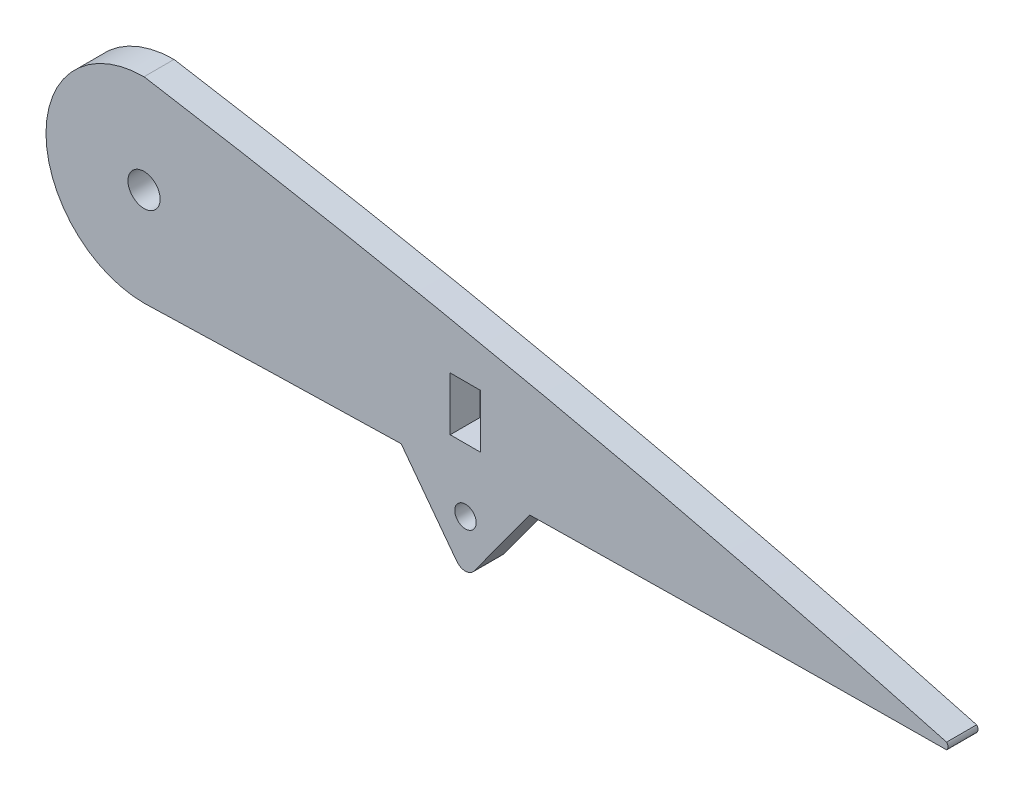
ISO-10303-21;
HEADER;
FILE_DESCRIPTION(('STEP AP214'),'2;1');
FILE_NAME('part.step','',(''),(''),'','','');
FILE_SCHEMA(('AUTOMOTIVE_DESIGN { 1 0 10303 214 1 1 1 1 }'));
ENDSEC;
DATA;
#1=APPLICATION_CONTEXT('core data for automotive mechanical design processes');
#2=APPLICATION_PROTOCOL_DEFINITION('international standard','automotive_design',2000,#1);
#3=PRODUCT_CONTEXT('',#1,'mechanical');
#4=PRODUCT('Part','Part','',(#3));
#5=PRODUCT_RELATED_PRODUCT_CATEGORY('part','',(#4));
#6=PRODUCT_DEFINITION_FORMATION('','',#4);
#7=PRODUCT_DEFINITION_CONTEXT('part definition',#1,'design');
#8=PRODUCT_DEFINITION('design','',#6,#7);
#9=PRODUCT_DEFINITION_SHAPE('','',#8);
#10=(LENGTH_UNIT() NAMED_UNIT(*) SI_UNIT(.MILLI.,.METRE.));
#11=(NAMED_UNIT(*) PLANE_ANGLE_UNIT() SI_UNIT($,.RADIAN.));
#12=(NAMED_UNIT(*) SI_UNIT($,.STERADIAN.) SOLID_ANGLE_UNIT());
#13=UNCERTAINTY_MEASURE_WITH_UNIT(LENGTH_MEASURE(1.E-05),#10,'distance_accuracy_value','');
#14=(GEOMETRIC_REPRESENTATION_CONTEXT(3) GLOBAL_UNCERTAINTY_ASSIGNED_CONTEXT((#13)) GLOBAL_UNIT_ASSIGNED_CONTEXT((#10,
#11,#12)) REPRESENTATION_CONTEXT('',''));
#15=CARTESIAN_POINT('',(0.,0.,0.));
#16=DIRECTION('',(0.,0.,1.));
#17=DIRECTION('',(1.,0.,0.));
#18=AXIS2_PLACEMENT_3D('',#15,#16,#17);
#19=CARTESIAN_POINT('',(138.143549961286,-100.777039100109,1.4));
#20=DIRECTION('',(-0.80787563884741,0.589352994526107,0.));
#21=DIRECTION('',(-0.589352994526107,-0.80787563884741,0.));
#22=AXIS2_PLACEMENT_3D('',#19,#20,#21);
#23=PLANE('',#22);
#24=DIRECTION('',(0.589352994526107,0.80787563884741,0.));
#25=VECTOR('',#24,1.);
#26=CARTESIAN_POINT('',(138.143549961286,-100.777039100109,-1.4));
#27=LINE('',#26,#25);
#28=CARTESIAN_POINT('',(205.887265796067,-7.91503921847926,-1.4));
#29=VERTEX_POINT('',#28);
#30=CARTESIAN_POINT('',(211.091334090503,-0.781385810383395,-1.4));
#31=VERTEX_POINT('',#30);
#32=EDGE_CURVE('E182',#29,#31,#27,.T.);
#33=ORIENTED_EDGE('',*,*,#32,.T.);
#34=DIRECTION('',(0.,0.,-1.));
#35=VECTOR('',#34,1.);
#36=CARTESIAN_POINT('',(211.091334090503,-0.781385810383395,1.4));
#37=LINE('',#36,#35);
#38=CARTESIAN_POINT('',(211.091334090503,-0.781385810383395,1.4));
#39=VERTEX_POINT('',#38);
#40=EDGE_CURVE('E11',#39,#31,#37,.T.);
#41=ORIENTED_EDGE('',*,*,#40,.F.);
#42=DIRECTION('',(0.589352994526107,0.80787563884741,0.));
#43=VECTOR('',#42,1.);
#44=CARTESIAN_POINT('',(138.143549961286,-100.777039100109,1.4));
#45=LINE('',#44,#43);
#46=CARTESIAN_POINT('',(205.887265796067,-7.91503921847926,1.4));
#47=VERTEX_POINT('',#46);
#48=EDGE_CURVE('E314',#47,#39,#45,.T.);
#49=ORIENTED_EDGE('',*,*,#48,.F.);
#50=DIRECTION('',(0.,0.,-1.));
#51=VECTOR('',#50,1.);
#52=CARTESIAN_POINT('',(205.887265796067,-7.91503921847926,1.4));
#53=LINE('',#52,#51);
#54=EDGE_CURVE('E216',#47,#29,#53,.T.);
#55=ORIENTED_EDGE('',*,*,#54,.T.);
#56=EDGE_LOOP('',(#33,#41,#49,#55));
#57=FACE_BOUND('',#56,.T.);
#58=ADVANCED_FACE('F37',(#57),#23,.F.);
#59=CARTESIAN_POINT('',(211.091334090503,-0.781385810385141,1.4));
#60=CARTESIAN_POINT('',(215.029550731743,-0.710611929763955,1.4));
#61=CARTESIAN_POINT('',(221.226120503685,-0.611852577215215,1.4));
#62=CARTESIAN_POINT('',(229.61763017219,-0.502926180051068,1.4));
#63=CARTESIAN_POINT('',(236.087353853958,-0.431514191746031,1.4));
#64=CARTESIAN_POINT('',(241.980776912645,-0.376520461471897,1.4));
#65=CARTESIAN_POINT('',(246.558970010783,-0.339535885925398,1.4));
#66=CARTESIAN_POINT('',(249.120490964528,-0.32127124245715,1.4));
#67=CARTESIAN_POINT('',(250.,-0.315,1.4));
#68=B_SPLINE_CURVE_WITH_KNOTS('',3,(#59,#60,#61,#62,#63,#64,#65,#66,#67),.UNSPECIFIED.,.F.,.F.,
(4,1,1,1,1,1,4),(0.846478182076588,0.893099151655267,0.919831064622048,0.945809917390178,
0.96968060086528,0.989589706283647,1.),.UNSPECIFIED.);
#69=DIRECTION('',(0.,0.,-1.));
#70=VECTOR('',#69,1.);
#71=SURFACE_OF_LINEAR_EXTRUSION('',#68,#70);
#72=CARTESIAN_POINT('',(211.091334090503,-0.781385810385141,-1.4));
#73=CARTESIAN_POINT('',(215.029550731743,-0.710611929763955,-1.4));
#74=CARTESIAN_POINT('',(221.226120503685,-0.611852577215215,-1.4));
#75=CARTESIAN_POINT('',(229.61763017219,-0.502926180051068,-1.4));
#76=CARTESIAN_POINT('',(236.087353853958,-0.431514191746031,-1.4));
#77=CARTESIAN_POINT('',(241.980776912645,-0.376520461471897,-1.4));
#78=CARTESIAN_POINT('',(246.558970010783,-0.339535885925398,-1.4));
#79=CARTESIAN_POINT('',(249.120490964528,-0.32127124245715,-1.4));
#80=CARTESIAN_POINT('',(250.,-0.315,-1.4));
#81=B_SPLINE_CURVE_WITH_KNOTS('',3,(#72,#73,#74,#75,#76,#77,#78,#79,#80),.UNSPECIFIED.,.F.,.F.,
(4,1,1,1,1,1,4),(0.846478182076588,0.893099151655267,0.919831064622048,0.945809917390178,
0.96968060086528,0.989589706283647,1.),.UNSPECIFIED.);
#82=CARTESIAN_POINT('',(250.,-0.315,-1.4));
#83=VERTEX_POINT('',#82);
#84=EDGE_CURVE('E185',#31,#83,#81,.T.);
#85=ORIENTED_EDGE('',*,*,#84,.T.);
#86=DIRECTION('',(0.,0.,-1.));
#87=VECTOR('',#86,1.);
#88=CARTESIAN_POINT('',(250.,-0.315,1.4));
#89=LINE('',#88,#87);
#90=CARTESIAN_POINT('',(250.,-0.315,1.4));
#91=VERTEX_POINT('',#90);
#92=EDGE_CURVE('E47',#91,#83,#89,.T.);
#93=ORIENTED_EDGE('',*,*,#92,.F.);
#94=EDGE_CURVE('E315',#39,#91,#68,.T.);
#95=ORIENTED_EDGE('',*,*,#94,.F.);
#96=ORIENTED_EDGE('',*,*,#40,.T.);
#97=EDGE_LOOP('',(#85,#93,#95,#96));
#98=FACE_BOUND('',#97,.T.);
#99=ADVANCED_FACE('F259',(#98),#71,.F.);
#100=CARTESIAN_POINT('',(249.685,0.,1.4));
#101=DIRECTION('',(0.,0.,-1.));
#102=DIRECTION('',(-1.,0.,0.));
#103=AXIS2_PLACEMENT_3D('',#100,#101,#102);
#104=CYLINDRICAL_SURFACE('',#103,0.445477272147512);
#105=CARTESIAN_POINT('',(249.685,0.,-1.4));
#106=DIRECTION('',(0.,0.,1.));
#107=DIRECTION('',(1.,0.,0.));
#108=AXIS2_PLACEMENT_3D('',#105,#106,#107);
#109=CIRCLE('',#108,0.445477272147512);
#110=CARTESIAN_POINT('',(250.,0.315,-1.4));
#111=VERTEX_POINT('',#110);
#112=EDGE_CURVE('E190',#111,#83,#109,.F.);
#113=ORIENTED_EDGE('',*,*,#112,.F.);
#114=DIRECTION('',(0.,0.,-1.));
#115=VECTOR('',#114,1.);
#116=CARTESIAN_POINT('',(250.,0.315,1.4));
#117=LINE('',#116,#115);
#118=CARTESIAN_POINT('',(250.,0.315,1.4));
#119=VERTEX_POINT('',#118);
#120=EDGE_CURVE('E222',#119,#111,#117,.T.);
#121=ORIENTED_EDGE('',*,*,#120,.F.);
#122=CARTESIAN_POINT('',(249.685,0.,1.4));
#123=DIRECTION('',(0.,0.,1.));
#124=DIRECTION('',(1.,0.,0.));
#125=AXIS2_PLACEMENT_3D('',#122,#123,#124);
#126=CIRCLE('',#125,0.445477272147512);
#127=EDGE_CURVE('E303',#119,#91,#126,.F.);
#128=ORIENTED_EDGE('',*,*,#127,.T.);
#129=ORIENTED_EDGE('',*,*,#92,.T.);
#130=EDGE_LOOP('',(#113,#121,#128,#129));
#131=FACE_BOUND('',#130,.T.);
#132=ADVANCED_FACE('F265',(#131),#104,.T.);
#133=CARTESIAN_POINT('',(250.,0.315,1.4));
#134=CARTESIAN_POINT('',(249.1556677398,0.545019817836279,1.4));
#135=CARTESIAN_POINT('',(246.72017569763,1.20851624251313,1.4));
#136=CARTESIAN_POINT('',(242.39133208333,2.35833905261626,1.4));
#137=CARTESIAN_POINT('',(236.8497612043,3.78762536446423,1.4));
#138=CARTESIAN_POINT('',(230.779918279366,5.29800883725429,1.4));
#139=CARTESIAN_POINT('',(224.455917947462,6.81286602762795,1.4));
#140=CARTESIAN_POINT('',(218.030543495663,8.2916106324586,1.4));
#141=CARTESIAN_POINT('',(211.562405044606,9.71973505661334,1.4));
#142=CARTESIAN_POINT('',(205.072411508973,11.0923749324442,1.4));
#143=CARTESIAN_POINT('',(198.567970912658,12.4078507263971,1.4));
#144=CARTESIAN_POINT('',(192.05236991352,13.6652979238497,1.4));
#145=CARTESIAN_POINT('',(185.527619972818,14.8640933031022,1.4));
#146=CARTESIAN_POINT('',(178.995338991115,16.0034047787228,1.4));
#147=CARTESIAN_POINT('',(172.457064741278,17.0823881152075,1.4));
#148=CARTESIAN_POINT('',(165.914317094847,18.0998278411168,1.4));
#149=CARTESIAN_POINT('',(159.368680729007,19.0545018148018,1.4));
#150=CARTESIAN_POINT('',(152.821805127969,19.9448856028229,1.4));
#151=CARTESIAN_POINT('',(146.275439401362,20.76928218283,1.4));
#152=CARTESIAN_POINT('',(139.731359791294,21.5256761133202,1.4));
#153=CARTESIAN_POINT('',(133.191836730309,22.2120042488889,1.4));
#154=CARTESIAN_POINT('',(126.658683026114,22.8257214286805,1.4));
#155=CARTESIAN_POINT('',(120.136770918309,23.363973266088,1.4));
#156=CARTESIAN_POINT('',(113.628567140501,23.8246773240715,1.4));
#157=CARTESIAN_POINT('',(107.152732037453,24.2002425936989,1.4));
#158=CARTESIAN_POINT('',(100.741095692949,24.4983995100481,1.4));
#159=CARTESIAN_POINT('',(94.4117527148801,24.6866497684384,1.4));
#160=CARTESIAN_POINT('',(88.1559179929208,24.7400956502598,1.4));
#161=CARTESIAN_POINT('',(81.9490430552625,24.658849143563,1.4));
#162=CARTESIAN_POINT('',(75.7805205915729,24.4410138083138,1.4));
#163=CARTESIAN_POINT('',(69.653692942001,24.0818848206021,1.4));
#164=CARTESIAN_POINT('',(63.5754105017725,23.5780063609574,1.4));
#165=CARTESIAN_POINT('',(57.5551895509689,22.9249466580897,1.4));
#166=CARTESIAN_POINT('',(51.6057626883655,22.1190655216041,1.4));
#167=CARTESIAN_POINT('',(45.7444003114454,21.1565644320825,1.4));
#168=CARTESIAN_POINT('',(39.9958575941734,20.035371389506,1.4));
#169=CARTESIAN_POINT('',(34.397919842374,18.756316234168,1.4));
#170=CARTESIAN_POINT('',(29.0103821035244,17.327615607561,1.4));
#171=CARTESIAN_POINT('',(23.9257984082512,15.7718649214876,1.4));
#172=CARTESIAN_POINT('',(19.2706788398757,14.1342694339559,1.4));
#173=CARTESIAN_POINT('',(15.1790983912921,12.4833354375465,1.4));
#174=CARTESIAN_POINT('',(11.7404757900967,10.8956109948061,1.4));
#175=CARTESIAN_POINT('',(8.95937186897629,9.42957736532332,1.4));
#176=CARTESIAN_POINT('',(6.76089118010329,8.10860319940964,1.4));
#177=CARTESIAN_POINT('',(5.03370974806799,6.92463805475642,1.4));
#178=CARTESIAN_POINT('',(3.67169493343308,5.85422966432144,1.4));
#179=CARTESIAN_POINT('',(2.59210112319415,4.87130536863603,1.4));
#180=CARTESIAN_POINT('',(1.73817566850273,3.95259574329487,1.4));
#181=CARTESIAN_POINT('',(1.06987082981603,3.08094637334676,1.4));
#182=CARTESIAN_POINT('',(0.571645410381898,2.24162210227498,1.4));
#183=CARTESIAN_POINT('',(0.215773898828885,1.43078539700941,1.4));
#184=CARTESIAN_POINT('',(0.102255581551055,0.88324169451159,1.4));
#185=CARTESIAN_POINT('',(0.047975,0.621425,1.4));
#186=B_SPLINE_CURVE_WITH_KNOTS('',3,(#133,#134,#135,#136,#137,#138,#139,#140,#141,#142,#143,
#144,#145,#146,#147,#148,#149,#150,#151,#152,#153,#154,#155,#156,#157,#158,#159,#160,#161,#162,
#163,#164,#165,#166,#167,#168,#169,#170,#171,#172,#173,#174,#175,#176,#177,#178,#179,#180,#181,
#182,#183,#184,#185),.UNSPECIFIED.,.F.,.F.,(4,1,1,1,1,1,1,1,1,1,1,1,1,1,1,1,1,1,1,1,1,1,1,1,1,1,
1,1,1,1,1,1,1,1,1,1,1,1,1,1,1,1,1,1,1,1,1,1,1,1,4),(0.,0.0101621996718152,0.029313053164405,
0.0520116049167946,0.0766194676467142,0.101948061207292,0.127526131749972,0.153184130655642,
0.178867887696566,0.204557902716051,0.230245711588722,0.255925967287604,0.281594302232909,
0.307246419826604,0.332878041533464,0.358484538095463,0.384061185999046,0.409602822472883,
0.435103874040524,0.460559416336008,0.485959195382529,0.511303069995141,0.53655151535457,
0.561723365940153,0.586628866723787,0.611085431247163,0.63525120042125,0.659272175841394,
0.683163753229342,0.706922144180534,0.730535909866309,0.753983199646257,0.777234690063445,
0.800246382303428,0.822950708941546,0.845237155368769,0.866915895838024,0.887662334604257,
0.906968280539555,0.924203157053238,0.938878974509372,0.95093161065299,0.960693484285195,
0.968646729467272,0.975232933115936,0.980794743901537,0.985583761312909,0.989781538836832,
0.99352131251264,0.996902112954681,1.),.UNSPECIFIED.);
#187=DIRECTION('',(0.,0.,-1.));
#188=VECTOR('',#187,1.);
#189=SURFACE_OF_LINEAR_EXTRUSION('',#186,#188);
#190=CARTESIAN_POINT('',(250.,0.315,-1.4));
#191=CARTESIAN_POINT('',(249.1556677398,0.545019817836279,-1.4));
#192=CARTESIAN_POINT('',(246.72017569763,1.20851624251313,-1.4));
#193=CARTESIAN_POINT('',(242.39133208333,2.35833905261626,-1.4));
#194=CARTESIAN_POINT('',(236.8497612043,3.78762536446423,-1.4));
#195=CARTESIAN_POINT('',(230.779918279366,5.29800883725429,-1.4));
#196=CARTESIAN_POINT('',(224.455917947462,6.81286602762795,-1.4));
#197=CARTESIAN_POINT('',(218.030543495663,8.2916106324586,-1.4));
#198=CARTESIAN_POINT('',(211.562405044606,9.71973505661334,-1.4));
#199=CARTESIAN_POINT('',(205.072411508973,11.0923749324442,-1.4));
#200=CARTESIAN_POINT('',(198.567970912658,12.4078507263971,-1.4));
#201=CARTESIAN_POINT('',(192.05236991352,13.6652979238497,-1.4));
#202=CARTESIAN_POINT('',(185.527619972818,14.8640933031022,-1.4));
#203=CARTESIAN_POINT('',(178.995338991115,16.0034047787228,-1.4));
#204=CARTESIAN_POINT('',(172.457064741278,17.0823881152075,-1.4));
#205=CARTESIAN_POINT('',(165.914317094847,18.0998278411168,-1.4));
#206=CARTESIAN_POINT('',(159.368680729007,19.0545018148018,-1.4));
#207=CARTESIAN_POINT('',(152.821805127969,19.9448856028229,-1.4));
#208=CARTESIAN_POINT('',(146.275439401362,20.76928218283,-1.4));
#209=CARTESIAN_POINT('',(139.731359791294,21.5256761133202,-1.4));
#210=CARTESIAN_POINT('',(133.191836730309,22.2120042488889,-1.4));
#211=CARTESIAN_POINT('',(126.658683026114,22.8257214286805,-1.4));
#212=CARTESIAN_POINT('',(120.136770918309,23.363973266088,-1.4));
#213=CARTESIAN_POINT('',(113.628567140501,23.8246773240715,-1.4));
#214=CARTESIAN_POINT('',(107.152732037453,24.2002425936989,-1.4));
#215=CARTESIAN_POINT('',(100.741095692949,24.4983995100481,-1.4));
#216=CARTESIAN_POINT('',(94.4117527148801,24.6866497684384,-1.4));
#217=CARTESIAN_POINT('',(88.1559179929208,24.7400956502598,-1.4));
#218=CARTESIAN_POINT('',(81.9490430552625,24.658849143563,-1.4));
#219=CARTESIAN_POINT('',(75.7805205915729,24.4410138083138,-1.4));
#220=CARTESIAN_POINT('',(69.653692942001,24.0818848206021,-1.4));
#221=CARTESIAN_POINT('',(63.5754105017725,23.5780063609574,-1.4));
#222=CARTESIAN_POINT('',(57.5551895509689,22.9249466580897,-1.4));
#223=CARTESIAN_POINT('',(51.6057626883655,22.1190655216041,-1.4));
#224=CARTESIAN_POINT('',(45.7444003114454,21.1565644320825,-1.4));
#225=CARTESIAN_POINT('',(39.9958575941734,20.035371389506,-1.4));
#226=CARTESIAN_POINT('',(34.397919842374,18.756316234168,-1.4));
#227=CARTESIAN_POINT('',(29.0103821035244,17.327615607561,-1.4));
#228=CARTESIAN_POINT('',(23.9257984082512,15.7718649214876,-1.4));
#229=CARTESIAN_POINT('',(19.2706788398757,14.1342694339559,-1.4));
#230=CARTESIAN_POINT('',(15.1790983912921,12.4833354375465,-1.4));
#231=CARTESIAN_POINT('',(11.7404757900967,10.8956109948061,-1.4));
#232=CARTESIAN_POINT('',(8.95937186897629,9.42957736532332,-1.4));
#233=CARTESIAN_POINT('',(6.76089118010329,8.10860319940964,-1.4));
#234=CARTESIAN_POINT('',(5.03370974806799,6.92463805475642,-1.4));
#235=CARTESIAN_POINT('',(3.67169493343308,5.85422966432144,-1.4));
#236=CARTESIAN_POINT('',(2.59210112319415,4.87130536863603,-1.4));
#237=CARTESIAN_POINT('',(1.73817566850273,3.95259574329487,-1.4));
#238=CARTESIAN_POINT('',(1.06987082981603,3.08094637334676,-1.4));
#239=CARTESIAN_POINT('',(0.571645410381898,2.24162210227498,-1.4));
#240=CARTESIAN_POINT('',(0.215773898828885,1.43078539700941,-1.4));
#241=CARTESIAN_POINT('',(0.102255581551055,0.88324169451159,-1.4));
#242=CARTESIAN_POINT('',(0.047975,0.621425,-1.4));
#243=B_SPLINE_CURVE_WITH_KNOTS('',3,(#190,#191,#192,#193,#194,#195,#196,#197,#198,#199,#200,
#201,#202,#203,#204,#205,#206,#207,#208,#209,#210,#211,#212,#213,#214,#215,#216,#217,#218,#219,
#220,#221,#222,#223,#224,#225,#226,#227,#228,#229,#230,#231,#232,#233,#234,#235,#236,#237,#238,
#239,#240,#241,#242),.UNSPECIFIED.,.F.,.F.,(4,1,1,1,1,1,1,1,1,1,1,1,1,1,1,1,1,1,1,1,1,1,1,1,1,1,
1,1,1,1,1,1,1,1,1,1,1,1,1,1,1,1,1,1,1,1,1,1,1,1,4),(0.,0.0101621996718152,0.029313053164405,
0.0520116049167946,0.0766194676467142,0.101948061207292,0.127526131749972,0.153184130655642,
0.178867887696566,0.204557902716051,0.230245711588722,0.255925967287604,0.281594302232909,
0.307246419826604,0.332878041533464,0.358484538095463,0.384061185999046,0.409602822472883,
0.435103874040524,0.460559416336008,0.485959195382529,0.511303069995141,0.53655151535457,
0.561723365940153,0.586628866723787,0.611085431247163,0.63525120042125,0.659272175841394,
0.683163753229342,0.706922144180534,0.730535909866309,0.753983199646257,0.777234690063445,
0.800246382303428,0.822950708941546,0.845237155368769,0.866915895838024,0.887662334604257,
0.906968280539555,0.924203157053238,0.938878974509372,0.95093161065299,0.960693484285195,
0.968646729467272,0.975232933115936,0.980794743901537,0.985583761312909,0.989781538836832,
0.99352131251264,0.996902112954681,1.),.UNSPECIFIED.);
#244=CARTESIAN_POINT('',(175.091334090503,16.6447875148628,-1.4));
#245=VERTEX_POINT('',#244);
#246=EDGE_CURVE('E196',#111,#245,#243,.T.);
#247=ORIENTED_EDGE('',*,*,#246,.T.);
#248=DIRECTION('',(0.,0.,-1.));
#249=VECTOR('',#248,1.);
#250=CARTESIAN_POINT('',(175.091334090503,16.6447875148628,1.4));
#251=LINE('',#250,#249);
#252=CARTESIAN_POINT('',(175.091334090503,16.6447875148628,1.4));
#253=VERTEX_POINT('',#252);
#254=EDGE_CURVE('E220',#253,#245,#251,.T.);
#255=ORIENTED_EDGE('',*,*,#254,.F.);
#256=EDGE_CURVE('E298',#119,#253,#186,.T.);
#257=ORIENTED_EDGE('',*,*,#256,.F.);
#258=ORIENTED_EDGE('',*,*,#120,.T.);
#259=EDGE_LOOP('',(#247,#255,#257,#258));
#260=FACE_BOUND('',#259,.T.);
#261=ADVANCED_FACE('F293',(#260),#189,.F.);
#262=CARTESIAN_POINT('',(175.091334090503,7.49391035659057,1.4));
#263=DIRECTION('',(0.,0.,-1.));
#264=DIRECTION('',(-1.,0.,0.));
#265=AXIS2_PLACEMENT_3D('',#262,#263,#264);
#266=CYLINDRICAL_SURFACE('',#265,9.15087715827226);
#267=CARTESIAN_POINT('',(175.091334090503,7.49391035659057,-1.4));
#268=DIRECTION('',(0.,0.,1.));
#269=DIRECTION('',(1.,0.,0.));
#270=AXIS2_PLACEMENT_3D('',#267,#268,#269);
#271=CIRCLE('',#270,9.15087715827226);
#272=CARTESIAN_POINT('',(175.091334090503,-1.65696680168169,-1.4));
#273=VERTEX_POINT('',#272);
#274=EDGE_CURVE('E201',#273,#245,#271,.F.);
#275=ORIENTED_EDGE('',*,*,#274,.F.);
#276=DIRECTION('',(0.,0.,-1.));
#277=VECTOR('',#276,1.);
#278=CARTESIAN_POINT('',(175.091334090503,-1.65696680168169,1.4));
#279=LINE('',#278,#277);
#280=CARTESIAN_POINT('',(175.091334090503,-1.65696680168169,1.4));
#281=VERTEX_POINT('',#280);
#282=EDGE_CURVE('E152',#281,#273,#279,.T.);
#283=ORIENTED_EDGE('',*,*,#282,.F.);
#284=CARTESIAN_POINT('',(175.091334090503,7.49391035659057,1.4));
#285=DIRECTION('',(0.,0.,1.));
#286=DIRECTION('',(1.,0.,0.));
#287=AXIS2_PLACEMENT_3D('',#284,#285,#286);
#288=CIRCLE('',#287,9.15087715827226);
#289=EDGE_CURVE('E145',#281,#253,#288,.F.);
#290=ORIENTED_EDGE('',*,*,#289,.T.);
#291=ORIENTED_EDGE('',*,*,#254,.T.);
#292=EDGE_LOOP('',(#275,#283,#290,#291));
#293=FACE_BOUND('',#292,.T.);
#294=ADVANCED_FACE('F290',(#293),#266,.T.);
#295=CARTESIAN_POINT('',(0.0479750000000144,0.621425,1.4));
#296=CARTESIAN_POINT('',(0.0227138203277174,0.37349008562278,1.4));
#297=CARTESIAN_POINT('',(-0.0278207890064324,-0.122499975050796,1.4));
#298=CARTESIAN_POINT('',(0.0779912124031773,-0.884434590165189,1.4));
#299=CARTESIAN_POINT('',(0.349695650480468,-1.63883807038264,1.4));
#300=CARTESIAN_POINT('',(0.814331135147485,-2.36506892355341,1.4));
#301=CARTESIAN_POINT('',(1.46348078042193,-3.03927524464573,1.4));
#302=CARTESIAN_POINT('',(2.29097301669106,-3.66099946963277,1.4));
#303=CARTESIAN_POINT('',(3.305928750312,-4.23577962104244,1.4));
#304=CARTESIAN_POINT('',(4.53525561919678,-4.77367414359708,1.4));
#305=CARTESIAN_POINT('',(6.02974568831353,-5.28219216458864,1.4));
#306=CARTESIAN_POINT('',(7.86898121529217,-5.76531667645038,1.4));
#307=CARTESIAN_POINT('',(10.1688313918681,-6.22171659287975,1.4));
#308=CARTESIAN_POINT('',(13.0754381889025,-6.63961873115025,1.4));
#309=CARTESIAN_POINT('',(16.7281153626736,-6.99295673762988,1.4));
#310=CARTESIAN_POINT('',(21.1899520960733,-7.2473451446477,1.4));
#311=CARTESIAN_POINT('',(26.3999844156188,-7.37663884891124,1.4));
#312=CARTESIAN_POINT('',(32.1973985639446,-7.37625691302805,1.4));
#313=CARTESIAN_POINT('',(38.3978067590693,-7.26143657975279,1.4));
#314=CARTESIAN_POINT('',(44.8576217679813,-7.05664135811407,1.4));
#315=CARTESIAN_POINT('',(51.4865430961523,-6.78645353185007,1.4));
#316=CARTESIAN_POINT('',(58.230980932138,-6.47232458679102,1.4));
#317=CARTESIAN_POINT('',(65.0520946060158,-6.13285226452119,1.4));
#318=CARTESIAN_POINT('',(71.9107727092363,-5.78400517673219,1.4));
#319=CARTESIAN_POINT('',(78.7713755762021,-5.43968045362797,1.4));
#320=CARTESIAN_POINT('',(85.6104986098069,-5.11095125256158,1.4));
#321=CARTESIAN_POINT('',(92.432107589932,-4.80495332571859,1.4));
#322=CARTESIAN_POINT('',(99.2550311901162,-4.53198165482118,1.4));
#323=CARTESIAN_POINT('',(106.097378404908,-4.27827467093475,1.4));
#324=CARTESIAN_POINT('',(112.969211680251,-4.00308992591385,1.4));
#325=CARTESIAN_POINT('',(119.864404254546,-3.72317618422458,1.4));
#326=CARTESIAN_POINT('',(126.77386047349,-3.4400672963698,1.4));
#327=CARTESIAN_POINT('',(133.681563213166,-3.1586956003963,1.4));
#328=CARTESIAN_POINT('',(140.581870407103,-2.88238072038319,1.4));
#329=CARTESIAN_POINT('',(147.472013761628,-2.61392295822804,1.4));
#330=CARTESIAN_POINT('',(154.352602410647,-2.35562641478671,1.4));
#331=CARTESIAN_POINT('',(161.225044134143,-2.10936992100992,1.4));
#332=CARTESIAN_POINT('',(168.090869746122,-1.87663407422723,1.4));
#333=CARTESIAN_POINT('',(174.951578521954,-1.65864310394481,1.4));
#334=CARTESIAN_POINT('',(181.808595965616,-1.4563781229633,1.4));
#335=CARTESIAN_POINT('',(188.663234462377,-1.27038337713284,1.4));
#336=CARTESIAN_POINT('',(194.423908611312,-1.12810208165174,1.4));
#337=CARTESIAN_POINT('',(197.899847219277,-1.04871934979755,1.4));
#338=CARTESIAN_POINT('',(199.091334090503,-1.02226768996704,1.4));
#339=B_SPLINE_CURVE_WITH_KNOTS('',3,(#295,#296,#297,#298,#299,#300,#301,#302,#303,#304,#305,
#306,#307,#308,#309,#310,#311,#312,#313,#314,#315,#316,#317,#318,#319,#320,#321,#322,#323,#324,
#325,#326,#327,#328,#329,#330,#331,#332,#333,#334,#335,#336,#337,#338),.UNSPECIFIED.,.F.,.F.,(4,
1,1,1,1,1,1,1,1,1,1,1,1,1,1,1,1,1,1,1,1,1,1,1,1,1,1,1,1,1,1,1,1,1,1,1,1,1,1,1,1,4),(0.,
0.00294144629716841,0.00588431899986843,0.00901612990907169,0.0123645467308032,
0.0160079338878462,0.0200368451305784,0.0245737277973679,0.029783834741521,0.0358970100073663,
0.043240439578336,0.0522759653413005,0.0636345893302709,0.0779831757705632,0.0956981612833506,
0.116520086015495,0.139660730330278,0.164312170171254,0.189918890388145,0.216157201054431,
0.242837761985605,0.269833582781319,0.296993021546457,0.324123271890544,0.351139106824528,
0.378035508721976,0.404946015910257,0.431960836658272,0.459078394602815,0.486347400324305,
0.513640830241323,0.540928594677757,0.568176028038828,0.595379568955062,0.622543444942076,
0.6496732603013,0.676775201241309,0.70385522836994,0.730918774891245,0.757971338224895,
0.785017763038357,0.799123890261102),.UNSPECIFIED.);
#340=DIRECTION('',(0.,0.,-1.));
#341=VECTOR('',#340,1.);
#342=SURFACE_OF_LINEAR_EXTRUSION('',#339,#341);
#343=CARTESIAN_POINT('',(0.0479750000000144,0.621425,-1.4));
#344=CARTESIAN_POINT('',(0.0227138203277174,0.37349008562278,-1.4));
#345=CARTESIAN_POINT('',(-0.0278207890064324,-0.122499975050796,-1.4));
#346=CARTESIAN_POINT('',(0.0779912124031773,-0.884434590165189,-1.4));
#347=CARTESIAN_POINT('',(0.349695650480468,-1.63883807038264,-1.4));
#348=CARTESIAN_POINT('',(0.814331135147485,-2.36506892355341,-1.4));
#349=CARTESIAN_POINT('',(1.46348078042193,-3.03927524464573,-1.4));
#350=CARTESIAN_POINT('',(2.29097301669106,-3.66099946963277,-1.4));
#351=CARTESIAN_POINT('',(3.305928750312,-4.23577962104244,-1.4));
#352=CARTESIAN_POINT('',(4.53525561919678,-4.77367414359708,-1.4));
#353=CARTESIAN_POINT('',(6.02974568831353,-5.28219216458864,-1.4));
#354=CARTESIAN_POINT('',(7.86898121529217,-5.76531667645038,-1.4));
#355=CARTESIAN_POINT('',(10.1688313918681,-6.22171659287975,-1.4));
#356=CARTESIAN_POINT('',(13.0754381889025,-6.63961873115025,-1.4));
#357=CARTESIAN_POINT('',(16.7281153626736,-6.99295673762988,-1.4));
#358=CARTESIAN_POINT('',(21.1899520960733,-7.2473451446477,-1.4));
#359=CARTESIAN_POINT('',(26.3999844156188,-7.37663884891124,-1.4));
#360=CARTESIAN_POINT('',(32.1973985639446,-7.37625691302805,-1.4));
#361=CARTESIAN_POINT('',(38.3978067590693,-7.26143657975279,-1.4));
#362=CARTESIAN_POINT('',(44.8576217679813,-7.05664135811407,-1.4));
#363=CARTESIAN_POINT('',(51.4865430961523,-6.78645353185007,-1.4));
#364=CARTESIAN_POINT('',(58.230980932138,-6.47232458679102,-1.4));
#365=CARTESIAN_POINT('',(65.0520946060158,-6.13285226452119,-1.4));
#366=CARTESIAN_POINT('',(71.9107727092363,-5.78400517673219,-1.4));
#367=CARTESIAN_POINT('',(78.7713755762021,-5.43968045362797,-1.4));
#368=CARTESIAN_POINT('',(85.6104986098069,-5.11095125256158,-1.4));
#369=CARTESIAN_POINT('',(92.432107589932,-4.80495332571859,-1.4));
#370=CARTESIAN_POINT('',(99.2550311901162,-4.53198165482118,-1.4));
#371=CARTESIAN_POINT('',(106.097378404908,-4.27827467093475,-1.4));
#372=CARTESIAN_POINT('',(112.969211680251,-4.00308992591385,-1.4));
#373=CARTESIAN_POINT('',(119.864404254546,-3.72317618422458,-1.4));
#374=CARTESIAN_POINT('',(126.77386047349,-3.4400672963698,-1.4));
#375=CARTESIAN_POINT('',(133.681563213166,-3.1586956003963,-1.4));
#376=CARTESIAN_POINT('',(140.581870407103,-2.88238072038319,-1.4));
#377=CARTESIAN_POINT('',(147.472013761628,-2.61392295822804,-1.4));
#378=CARTESIAN_POINT('',(154.352602410647,-2.35562641478671,-1.4));
#379=CARTESIAN_POINT('',(161.225044134143,-2.10936992100992,-1.4));
#380=CARTESIAN_POINT('',(168.090869746122,-1.87663407422723,-1.4));
#381=CARTESIAN_POINT('',(174.951578521954,-1.65864310394481,-1.4));
#382=CARTESIAN_POINT('',(181.808595965616,-1.4563781229633,-1.4));
#383=CARTESIAN_POINT('',(188.663234462377,-1.27038337713284,-1.4));
#384=CARTESIAN_POINT('',(194.423908611312,-1.12810208165174,-1.4));
#385=CARTESIAN_POINT('',(197.899847219277,-1.04871934979755,-1.4));
#386=CARTESIAN_POINT('',(199.091334090503,-1.02226768996704,-1.4));
#387=B_SPLINE_CURVE_WITH_KNOTS('',3,(#343,#344,#345,#346,#347,#348,#349,#350,#351,#352,#353,
#354,#355,#356,#357,#358,#359,#360,#361,#362,#363,#364,#365,#366,#367,#368,#369,#370,#371,#372,
#373,#374,#375,#376,#377,#378,#379,#380,#381,#382,#383,#384,#385,#386),.UNSPECIFIED.,.F.,.F.,(4,
1,1,1,1,1,1,1,1,1,1,1,1,1,1,1,1,1,1,1,1,1,1,1,1,1,1,1,1,1,1,1,1,1,1,1,1,1,1,1,1,4),(0.,
0.00294144629716841,0.00588431899986843,0.00901612990907169,0.0123645467308032,
0.0160079338878462,0.0200368451305784,0.0245737277973679,0.029783834741521,0.0358970100073663,
0.043240439578336,0.0522759653413005,0.0636345893302709,0.0779831757705632,0.0956981612833506,
0.116520086015495,0.139660730330278,0.164312170171254,0.189918890388145,0.216157201054431,
0.242837761985605,0.269833582781319,0.296993021546457,0.324123271890544,0.351139106824528,
0.378035508721976,0.404946015910257,0.431960836658272,0.459078394602815,0.486347400324305,
0.513640830241323,0.540928594677757,0.568176028038828,0.595379568955062,0.622543444942076,
0.6496732603013,0.676775201241309,0.70385522836994,0.730918774891245,0.757971338224895,
0.785017763038357,0.799123890261102),.UNSPECIFIED.);
#388=CARTESIAN_POINT('',(199.091334090503,-1.02226768997041,-1.4));
#389=VERTEX_POINT('',#388);
#390=EDGE_CURVE('E151',#273,#389,#387,.T.);
#391=ORIENTED_EDGE('',*,*,#390,.T.);
#392=DIRECTION('',(0.,0.,-1.));
#393=VECTOR('',#392,1.);
#394=CARTESIAN_POINT('',(199.091334090503,-1.02226768997041,1.4));
#395=LINE('',#394,#393);
#396=CARTESIAN_POINT('',(199.091334090503,-1.02226768997041,1.4));
#397=VERTEX_POINT('',#396);
#398=EDGE_CURVE('E148',#397,#389,#395,.T.);
#399=ORIENTED_EDGE('',*,*,#398,.F.);
#400=EDGE_CURVE('E139',#281,#397,#339,.T.);
#401=ORIENTED_EDGE('',*,*,#400,.F.);
#402=ORIENTED_EDGE('',*,*,#282,.T.);
#403=EDGE_LOOP('',(#391,#399,#401,#402));
#404=FACE_BOUND('',#403,.T.);
#405=ADVANCED_FACE('F149',(#404),#342,.F.);
#406=CARTESIAN_POINT('',(126.741670789127,95.2488706749325,1.4));
#407=DIRECTION('',(0.799416457975091,0.600777268809798,0.));
#408=DIRECTION('',(-0.600777268809798,0.799416457975091,0.));
#409=AXIS2_PLACEMENT_3D('',#406,#407,#408);
#410=PLANE('',#409);
#411=DIRECTION('',(0.600777268809798,-0.799416457975091,0.));
#412=VECTOR('',#411,1.);
#413=CARTESIAN_POINT('',(126.741670789127,95.2488706749325,-1.4));
#414=LINE('',#413,#412);
#415=CARTESIAN_POINT('',(204.279973699244,-7.92646349276267,-1.4));
#416=VERTEX_POINT('',#415);
#417=EDGE_CURVE('E97',#389,#416,#414,.T.);
#418=ORIENTED_EDGE('',*,*,#417,.T.);
#419=DIRECTION('',(0.,0.,-1.));
#420=VECTOR('',#419,1.);
#421=CARTESIAN_POINT('',(204.279973699244,-7.92646349276267,1.4));
#422=LINE('',#421,#420);
#423=CARTESIAN_POINT('',(204.279973699244,-7.92646349276267,1.4));
#424=VERTEX_POINT('',#423);
#425=EDGE_CURVE('E153',#424,#416,#422,.T.);
#426=ORIENTED_EDGE('',*,*,#425,.F.);
#427=DIRECTION('',(0.600777268809798,-0.799416457975091,0.));
#428=VECTOR('',#427,1.);
#429=CARTESIAN_POINT('',(126.741670789127,95.2488706749325,1.4));
#430=LINE('',#429,#428);
#431=EDGE_CURVE('E143',#397,#424,#430,.T.);
#432=ORIENTED_EDGE('',*,*,#431,.F.);
#433=ORIENTED_EDGE('',*,*,#398,.T.);
#434=EDGE_LOOP('',(#418,#426,#432,#433));
#435=FACE_BOUND('',#434,.T.);
#436=ADVANCED_FACE('F155',(#435),#410,.F.);
#437=CARTESIAN_POINT('',(0.,6.99391035659057,1.4));
#438=DIRECTION('',(0.,1.,0.));
#439=DIRECTION('',(0.,0.,1.));
#440=AXIS2_PLACEMENT_3D('',#437,#438,#439);
#441=PLANE('',#440);
#442=DIRECTION('',(1.,0.,0.));
#443=VECTOR('',#442,1.);
#444=CARTESIAN_POINT('',(0.,6.99391035659057,-1.4));
#445=LINE('',#444,#443);
#446=CARTESIAN_POINT('',(203.666334090503,6.99391035659057,-1.4));
#447=VERTEX_POINT('',#446);
#448=CARTESIAN_POINT('',(206.516334090503,6.99391035659057,-1.4));
#449=VERTEX_POINT('',#448);
#450=EDGE_CURVE('E164',#447,#449,#445,.T.);
#451=ORIENTED_EDGE('',*,*,#450,.T.);
#452=DIRECTION('',(0.,0.,-1.));
#453=VECTOR('',#452,1.);
#454=CARTESIAN_POINT('',(206.516334090503,6.99391035659057,1.4));
#455=LINE('',#454,#453);
#456=CARTESIAN_POINT('',(206.516334090503,6.99391035659057,1.4));
#457=VERTEX_POINT('',#456);
#458=EDGE_CURVE('E41',#457,#449,#455,.T.);
#459=ORIENTED_EDGE('',*,*,#458,.F.);
#460=DIRECTION('',(1.,0.,0.));
#461=VECTOR('',#460,1.);
#462=CARTESIAN_POINT('',(0.,6.99391035659057,1.4));
#463=LINE('',#462,#461);
#464=CARTESIAN_POINT('',(203.666334090503,6.99391035659057,1.4));
#465=VERTEX_POINT('',#464);
#466=EDGE_CURVE('E215',#465,#457,#463,.T.);
#467=ORIENTED_EDGE('',*,*,#466,.F.);
#468=DIRECTION('',(0.,0.,-1.));
#469=VECTOR('',#468,1.);
#470=CARTESIAN_POINT('',(203.666334090503,6.99391035659057,1.4));
#471=LINE('',#470,#469);
#472=EDGE_CURVE('E157',#465,#447,#471,.T.);
#473=ORIENTED_EDGE('',*,*,#472,.T.);
#474=EDGE_LOOP('',(#451,#459,#467,#473));
#475=FACE_BOUND('',#474,.T.);
#476=ADVANCED_FACE('F39',(#475),#441,.F.);
#477=CARTESIAN_POINT('',(206.516334090503,0.,1.4));
#478=DIRECTION('',(1.,0.,0.));
#479=DIRECTION('',(0.,0.,-1.));
#480=AXIS2_PLACEMENT_3D('',#477,#478,#479);
#481=PLANE('',#480);
#482=DIRECTION('',(0.,-1.,0.));
#483=VECTOR('',#482,1.);
#484=CARTESIAN_POINT('',(206.516334090503,0.,-1.4));
#485=LINE('',#484,#483);
#486=CARTESIAN_POINT('',(206.516334090503,1.99391035659057,-1.4));
#487=VERTEX_POINT('',#486);
#488=EDGE_CURVE('E167',#449,#487,#485,.T.);
#489=ORIENTED_EDGE('',*,*,#488,.T.);
#490=DIRECTION('',(0.,0.,-1.));
#491=VECTOR('',#490,1.);
#492=CARTESIAN_POINT('',(206.516334090503,1.99391035659057,1.4));
#493=LINE('',#492,#491);
#494=CARTESIAN_POINT('',(206.516334090503,1.99391035659057,1.4));
#495=VERTEX_POINT('',#494);
#496=EDGE_CURVE('E227',#495,#487,#493,.T.);
#497=ORIENTED_EDGE('',*,*,#496,.F.);
#498=DIRECTION('',(0.,-1.,0.));
#499=VECTOR('',#498,1.);
#500=CARTESIAN_POINT('',(206.516334090503,0.,1.4));
#501=LINE('',#500,#499);
#502=EDGE_CURVE('E112',#457,#495,#501,.T.);
#503=ORIENTED_EDGE('',*,*,#502,.F.);
#504=ORIENTED_EDGE('',*,*,#458,.T.);
#505=EDGE_LOOP('',(#489,#497,#503,#504));
#506=FACE_BOUND('',#505,.T.);
#507=ADVANCED_FACE('F232',(#506),#481,.F.);
#508=CARTESIAN_POINT('',(0.,1.9939103565906,1.4));
#509=DIRECTION('',(0.,1.,0.));
#510=DIRECTION('',(-1.,0.,0.));
#511=AXIS2_PLACEMENT_3D('',#508,#509,#510);
#512=PLANE('',#511);
#513=DIRECTION('',(1.,0.,0.));
#514=VECTOR('',#513,1.);
#515=CARTESIAN_POINT('',(0.,1.9939103565906,-1.4));
#516=LINE('',#515,#514);
#517=CARTESIAN_POINT('',(203.666334090503,1.99391035659057,-1.4));
#518=VERTEX_POINT('',#517);
#519=EDGE_CURVE('E170',#518,#487,#516,.T.);
#520=ORIENTED_EDGE('',*,*,#519,.F.);
#521=DIRECTION('',(0.,0.,-1.));
#522=VECTOR('',#521,1.);
#523=CARTESIAN_POINT('',(203.666334090503,1.99391035659057,1.4));
#524=LINE('',#523,#522);
#525=CARTESIAN_POINT('',(203.666334090503,1.99391035659057,1.4));
#526=VERTEX_POINT('',#525);
#527=EDGE_CURVE('E226',#526,#518,#524,.T.);
#528=ORIENTED_EDGE('',*,*,#527,.F.);
#529=DIRECTION('',(1.,0.,0.));
#530=VECTOR('',#529,1.);
#531=CARTESIAN_POINT('',(0.,1.9939103565906,1.4));
#532=LINE('',#531,#530);
#533=EDGE_CURVE('E331',#526,#495,#532,.T.);
#534=ORIENTED_EDGE('',*,*,#533,.T.);
#535=ORIENTED_EDGE('',*,*,#496,.T.);
#536=EDGE_LOOP('',(#520,#528,#534,#535));
#537=FACE_BOUND('',#536,.T.);
#538=ADVANCED_FACE('F246',(#537),#512,.T.);
#539=CARTESIAN_POINT('',(205.091334090503,-3.90608964340943,1.4));
#540=DIRECTION('',(0.,0.,-1.));
#541=DIRECTION('',(-1.,0.,0.));
#542=AXIS2_PLACEMENT_3D('',#539,#540,#541);
#543=CYLINDRICAL_SURFACE('',#542,0.999999999999998);
#544=CARTESIAN_POINT('',(205.091334090503,-3.90608964340943,1.4));
#545=DIRECTION('',(0.,0.,1.));
#546=DIRECTION('',(1.,0.,0.));
#547=AXIS2_PLACEMENT_3D('',#544,#545,#546);
#548=CIRCLE('',#547,0.999999999999998);
#549=CARTESIAN_POINT('',(206.091334090503,-3.90608964340943,1.4));
#550=VERTEX_POINT('',#549);
#551=EDGE_CURVE('E316',#550,#550,#548,.T.);
#552=ORIENTED_EDGE('',*,*,#551,.T.);
#553=EDGE_LOOP('',(#552));
#554=FACE_BOUND('',#553,.T.);
#555=CARTESIAN_POINT('',(205.091334090503,-3.90608964340943,-1.4));
#556=DIRECTION('',(0.,0.,1.));
#557=DIRECTION('',(1.,0.,0.));
#558=AXIS2_PLACEMENT_3D('',#555,#556,#557);
#559=CIRCLE('',#558,0.999999999999998);
#560=CARTESIAN_POINT('',(206.091334090503,-3.90608964340943,-1.4));
#561=VERTEX_POINT('',#560);
#562=EDGE_CURVE('E179',#561,#561,#559,.T.);
#563=ORIENTED_EDGE('',*,*,#562,.F.);
#564=EDGE_LOOP('',(#563));
#565=FACE_BOUND('',#564,.T.);
#566=ADVANCED_FACE('F248',(#554,#565),#543,.F.);
#567=CARTESIAN_POINT('',(175.091334090503,7.49391035659057,1.4));
#568=DIRECTION('',(0.,0.,-1.));
#569=DIRECTION('',(-1.,0.,0.));
#570=AXIS2_PLACEMENT_3D('',#567,#568,#569);
#571=CYLINDRICAL_SURFACE('',#570,1.5);
#572=CARTESIAN_POINT('',(175.091334090503,7.49391035659057,1.4));
#573=DIRECTION('',(0.,0.,1.));
#574=DIRECTION('',(1.,0.,0.));
#575=AXIS2_PLACEMENT_3D('',#572,#573,#574);
#576=CIRCLE('',#575,1.5);
#577=CARTESIAN_POINT('',(176.591334090503,7.49391035659057,1.4));
#578=VERTEX_POINT('',#577);
#579=EDGE_CURVE('E319',#578,#578,#576,.T.);
#580=ORIENTED_EDGE('',*,*,#579,.T.);
#581=EDGE_LOOP('',(#580));
#582=FACE_BOUND('',#581,.T.);
#583=CARTESIAN_POINT('',(175.091334090503,7.49391035659057,-1.4));
#584=DIRECTION('',(0.,0.,1.));
#585=DIRECTION('',(1.,0.,0.));
#586=AXIS2_PLACEMENT_3D('',#583,#584,#585);
#587=CIRCLE('',#586,1.5);
#588=CARTESIAN_POINT('',(176.591334090503,7.49391035659057,-1.4));
#589=VERTEX_POINT('',#588);
#590=EDGE_CURVE('E176',#589,#589,#587,.T.);
#591=ORIENTED_EDGE('',*,*,#590,.F.);
#592=EDGE_LOOP('',(#591));
#593=FACE_BOUND('',#592,.T.);
#594=ADVANCED_FACE('F254',(#582,#593),#571,.F.);
#595=CARTESIAN_POINT('',(203.666334090503,0.,1.4));
#596=DIRECTION('',(1.,0.,0.));
#597=DIRECTION('',(0.,0.,-1.));
#598=AXIS2_PLACEMENT_3D('',#595,#596,#597);
#599=PLANE('',#598);
#600=DIRECTION('',(0.,-1.,0.));
#601=VECTOR('',#600,1.);
#602=CARTESIAN_POINT('',(203.666334090503,0.,-1.4));
#603=LINE('',#602,#601);
#604=EDGE_CURVE('E173',#447,#518,#603,.T.);
#605=ORIENTED_EDGE('',*,*,#604,.F.);
#606=ORIENTED_EDGE('',*,*,#472,.F.);
#607=DIRECTION('',(0.,-1.,0.));
#608=VECTOR('',#607,1.);
#609=CARTESIAN_POINT('',(203.666334090503,0.,1.4));
#610=LINE('',#609,#608);
#611=EDGE_CURVE('E244',#465,#526,#610,.T.);
#612=ORIENTED_EDGE('',*,*,#611,.T.);
#613=ORIENTED_EDGE('',*,*,#527,.T.);
#614=EDGE_LOOP('',(#605,#606,#612,#613));
#615=FACE_BOUND('',#614,.T.);
#616=ADVANCED_FACE('F241',(#615),#599,.T.);
#617=CARTESIAN_POINT('',(205.07939015722,-7.32568622395327,1.4));
#618=DIRECTION('',(0.,0.,-1.));
#619=DIRECTION('',(-1.,0.,0.));
#620=AXIS2_PLACEMENT_3D('',#617,#618,#619);
#621=CYLINDRICAL_SURFACE('',#620,0.999999999999908);
#622=CARTESIAN_POINT('',(205.07939015722,-7.32568622395327,-1.4));
#623=DIRECTION('',(0.,0.,1.));
#624=DIRECTION('',(1.,0.,0.));
#625=AXIS2_PLACEMENT_3D('',#622,#623,#624);
#626=CIRCLE('',#625,0.999999999999908);
#627=EDGE_CURVE('E103',#416,#29,#626,.T.);
#628=ORIENTED_EDGE('',*,*,#627,.T.);
#629=ORIENTED_EDGE('',*,*,#54,.F.);
#630=CARTESIAN_POINT('',(205.07939015722,-7.32568622395327,1.4));
#631=DIRECTION('',(0.,0.,1.));
#632=DIRECTION('',(1.,0.,0.));
#633=AXIS2_PLACEMENT_3D('',#630,#631,#632);
#634=CIRCLE('',#633,0.999999999999908);
#635=EDGE_CURVE('E56',#424,#47,#634,.T.);
#636=ORIENTED_EDGE('',*,*,#635,.F.);
#637=ORIENTED_EDGE('',*,*,#425,.T.);
#638=EDGE_LOOP('',(#628,#629,#636,#637));
#639=FACE_BOUND('',#638,.T.);
#640=ADVANCED_FACE('F274',(#639),#621,.T.);
#641=CARTESIAN_POINT('',(0.,0.,1.4));
#642=DIRECTION('',(0.,0.,1.));
#643=DIRECTION('',(1.,0.,0.));
#644=AXIS2_PLACEMENT_3D('',#641,#642,#643);
#645=PLANE('',#644);
#646=ORIENTED_EDGE('',*,*,#466,.T.);
#647=ORIENTED_EDGE('',*,*,#502,.T.);
#648=ORIENTED_EDGE('',*,*,#533,.F.);
#649=ORIENTED_EDGE('',*,*,#611,.F.);
#650=EDGE_LOOP('',(#646,#647,#648,#649));
#651=FACE_BOUND('',#650,.T.);
#652=ORIENTED_EDGE('',*,*,#579,.F.);
#653=EDGE_LOOP('',(#652));
#654=FACE_BOUND('',#653,.T.);
#655=ORIENTED_EDGE('',*,*,#551,.F.);
#656=EDGE_LOOP('',(#655));
#657=FACE_BOUND('',#656,.T.);
#658=ORIENTED_EDGE('',*,*,#48,.T.);
#659=ORIENTED_EDGE('',*,*,#94,.T.);
#660=ORIENTED_EDGE('',*,*,#127,.F.);
#661=ORIENTED_EDGE('',*,*,#256,.T.);
#662=ORIENTED_EDGE('',*,*,#289,.F.);
#663=ORIENTED_EDGE('',*,*,#400,.T.);
#664=ORIENTED_EDGE('',*,*,#431,.T.);
#665=ORIENTED_EDGE('',*,*,#635,.T.);
#666=EDGE_LOOP('',(#658,#659,#660,#661,#662,#663,#664,#665));
#667=FACE_BOUND('',#666,.T.);
#668=ADVANCED_FACE('F141',(#651,#654,#657,#667),#645,.T.);
#669=CARTESIAN_POINT('',(0.,0.,-1.4));
#670=DIRECTION('',(0.,0.,1.));
#671=DIRECTION('',(1.,0.,0.));
#672=AXIS2_PLACEMENT_3D('',#669,#670,#671);
#673=PLANE('',#672);
#674=ORIENTED_EDGE('',*,*,#450,.F.);
#675=ORIENTED_EDGE('',*,*,#604,.T.);
#676=ORIENTED_EDGE('',*,*,#519,.T.);
#677=ORIENTED_EDGE('',*,*,#488,.F.);
#678=EDGE_LOOP('',(#674,#675,#676,#677));
#679=FACE_BOUND('',#678,.T.);
#680=ORIENTED_EDGE('',*,*,#590,.T.);
#681=EDGE_LOOP('',(#680));
#682=FACE_BOUND('',#681,.T.);
#683=ORIENTED_EDGE('',*,*,#562,.T.);
#684=EDGE_LOOP('',(#683));
#685=FACE_BOUND('',#684,.T.);
#686=ORIENTED_EDGE('',*,*,#32,.F.);
#687=ORIENTED_EDGE('',*,*,#627,.F.);
#688=ORIENTED_EDGE('',*,*,#417,.F.);
#689=ORIENTED_EDGE('',*,*,#390,.F.);
#690=ORIENTED_EDGE('',*,*,#274,.T.);
#691=ORIENTED_EDGE('',*,*,#246,.F.);
#692=ORIENTED_EDGE('',*,*,#112,.T.);
#693=ORIENTED_EDGE('',*,*,#84,.F.);
#694=EDGE_LOOP('',(#686,#687,#688,#689,#690,#691,#692,#693));
#695=FACE_BOUND('',#694,.T.);
#696=ADVANCED_FACE('F238',(#679,#682,#685,#695),#673,.F.);
#697=CLOSED_SHELL('',(#58,#99,#132,#261,#294,#405,#436,#476,#507,#538,#566,#594,#616,#640,#668,#696));
#698=MANIFOLD_SOLID_BREP('B2',#697);
#699=ADVANCED_BREP_SHAPE_REPRESENTATION('',(#18,#698),#14);
#700=SHAPE_DEFINITION_REPRESENTATION(#9,#699);
ENDSEC;
END-ISO-10303-21;
